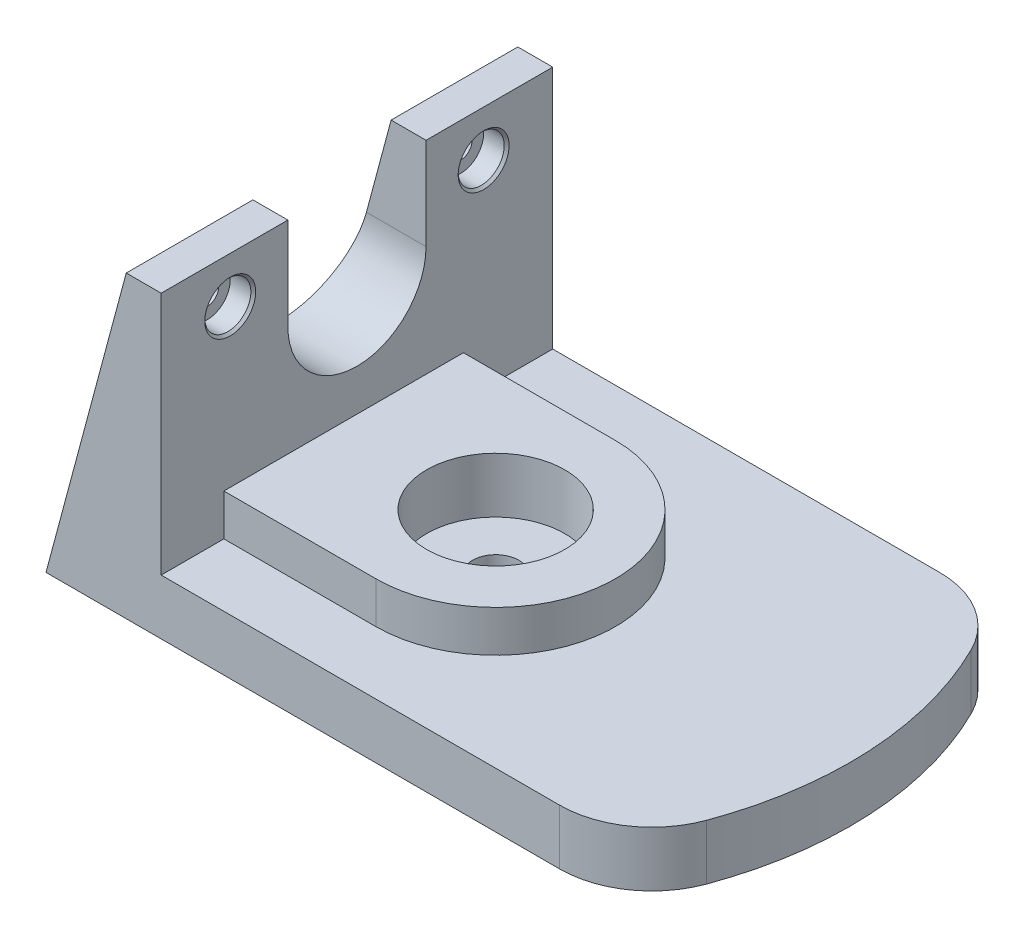
ISO-10303-21;
HEADER;
FILE_DESCRIPTION(('STEP AP214'),'2;1');
FILE_NAME('part.step','',(''),(''),'','','');
FILE_SCHEMA(('AUTOMOTIVE_DESIGN { 1 0 10303 214 1 1 1 1 }'));
ENDSEC;
DATA;
#1=APPLICATION_CONTEXT('core data for automotive mechanical design processes');
#2=APPLICATION_PROTOCOL_DEFINITION('international standard','automotive_design',2000,#1);
#3=PRODUCT_CONTEXT('',#1,'mechanical');
#4=PRODUCT('Part','Part','',(#3));
#5=PRODUCT_RELATED_PRODUCT_CATEGORY('part','',(#4));
#6=PRODUCT_DEFINITION_FORMATION('','',#4);
#7=PRODUCT_DEFINITION_CONTEXT('part definition',#1,'design');
#8=PRODUCT_DEFINITION('design','',#6,#7);
#9=PRODUCT_DEFINITION_SHAPE('','',#8);
#10=(LENGTH_UNIT() NAMED_UNIT(*) SI_UNIT(.MILLI.,.METRE.));
#11=(NAMED_UNIT(*) PLANE_ANGLE_UNIT() SI_UNIT($,.RADIAN.));
#12=(NAMED_UNIT(*) SI_UNIT($,.STERADIAN.) SOLID_ANGLE_UNIT());
#13=UNCERTAINTY_MEASURE_WITH_UNIT(LENGTH_MEASURE(1.E-05),#10,'distance_accuracy_value','');
#14=(GEOMETRIC_REPRESENTATION_CONTEXT(3) GLOBAL_UNCERTAINTY_ASSIGNED_CONTEXT((#13)) GLOBAL_UNIT_ASSIGNED_CONTEXT((#10,
#11,#12)) REPRESENTATION_CONTEXT('',''));
#15=CARTESIAN_POINT('',(0.,0.,0.));
#16=DIRECTION('',(0.,0.,1.));
#17=DIRECTION('',(1.,0.,0.));
#18=AXIS2_PLACEMENT_3D('',#15,#16,#17);
#19=CARTESIAN_POINT('',(58.,21.,2.88479980469305));
#20=DIRECTION('',(0.,-1.,0.));
#21=DIRECTION('',(1.,0.,0.));
#22=AXIS2_PLACEMENT_3D('',#19,#20,#21);
#23=PLANE('',#22);
#24=DIRECTION('',(-1.,0.,0.));
#25=VECTOR('',#24,1.);
#26=CARTESIAN_POINT('',(58.,21.,28.884799804693));
#27=LINE('',#26,#25);
#28=CARTESIAN_POINT('',(58.,21.,28.884799804693));
#29=VERTEX_POINT('',#28);
#30=CARTESIAN_POINT('',(25.,21.,28.8847998046931));
#31=VERTEX_POINT('',#30);
#32=EDGE_CURVE('E199',#29,#31,#27,.T.);
#33=ORIENTED_EDGE('',*,*,#32,.F.);
#34=CARTESIAN_POINT('',(58.,21.,2.88479980469305));
#35=DIRECTION('',(0.,-1.,0.));
#36=DIRECTION('',(1.,0.,0.));
#37=AXIS2_PLACEMENT_3D('',#34,#35,#36);
#38=CIRCLE('',#37,26.);
#39=CARTESIAN_POINT('',(58.,21.,-23.115200195307));
#40=VERTEX_POINT('',#39);
#41=EDGE_CURVE('E215',#40,#29,#38,.T.);
#42=ORIENTED_EDGE('',*,*,#41,.F.);
#43=DIRECTION('',(1.,0.,0.));
#44=VECTOR('',#43,1.);
#45=CARTESIAN_POINT('',(25.,21.,-23.1152001953069));
#46=LINE('',#45,#44);
#47=CARTESIAN_POINT('',(25.,21.,-23.1152001953069));
#48=VERTEX_POINT('',#47);
#49=EDGE_CURVE('E208',#48,#40,#46,.T.);
#50=ORIENTED_EDGE('',*,*,#49,.F.);
#51=DIRECTION('',(0.,0.,-1.));
#52=VECTOR('',#51,1.);
#53=CARTESIAN_POINT('',(25.,21.,28.8847998046931));
#54=LINE('',#53,#52);
#55=EDGE_CURVE('E204',#31,#48,#54,.T.);
#56=ORIENTED_EDGE('',*,*,#55,.F.);
#57=EDGE_LOOP('',(#33,#42,#50,#56));
#58=FACE_BOUND('',#57,.T.);
#59=CARTESIAN_POINT('',(58.,21.,2.88479980469305));
#60=DIRECTION('',(0.,1.,0.));
#61=DIRECTION('',(0.,0.,1.));
#62=AXIS2_PLACEMENT_3D('',#59,#60,#61);
#63=CIRCLE('',#62,15.);
#64=CARTESIAN_POINT('',(58.,21.,17.884799804693));
#65=VERTEX_POINT('',#64);
#66=EDGE_CURVE('E858',#65,#65,#63,.T.);
#67=ORIENTED_EDGE('',*,*,#66,.F.);
#68=EDGE_LOOP('',(#67));
#69=FACE_BOUND('',#68,.T.);
#70=ADVANCED_FACE('F51',(#58,#69),#23,.F.);
#71=CARTESIAN_POINT('',(25.,65.,42.5));
#72=DIRECTION('',(0.,-1.,0.));
#73=DIRECTION('',(0.,0.,-1.));
#74=AXIS2_PLACEMENT_3D('',#71,#72,#73);
#75=PLANE('',#74);
#76=DIRECTION('',(1.,0.,0.));
#77=VECTOR('',#76,1.);
#78=CARTESIAN_POINT('',(0.,65.,15.));
#79=LINE('',#78,#77);
#80=CARTESIAN_POINT('',(17.4166975080225,65.,15.));
#81=VERTEX_POINT('',#80);
#82=CARTESIAN_POINT('',(25.,65.,15.));
#83=VERTEX_POINT('',#82);
#84=EDGE_CURVE('E176',#81,#83,#79,.T.);
#85=ORIENTED_EDGE('',*,*,#84,.F.);
#86=DIRECTION('',(0.,0.,-1.));
#87=VECTOR('',#86,1.);
#88=CARTESIAN_POINT('',(17.4166975080225,65.,42.5));
#89=LINE('',#88,#87);
#90=CARTESIAN_POINT('',(17.4166975080225,65.,42.5));
#91=VERTEX_POINT('',#90);
#92=EDGE_CURVE('E284',#91,#81,#89,.T.);
#93=ORIENTED_EDGE('',*,*,#92,.F.);
#94=DIRECTION('',(-1.,0.,0.));
#95=VECTOR('',#94,1.);
#96=CARTESIAN_POINT('',(25.,65.,42.5));
#97=LINE('',#96,#95);
#98=CARTESIAN_POINT('',(25.,65.,42.5));
#99=VERTEX_POINT('',#98);
#100=EDGE_CURVE('E251',#99,#91,#97,.T.);
#101=ORIENTED_EDGE('',*,*,#100,.F.);
#102=DIRECTION('',(0.,0.,-1.));
#103=VECTOR('',#102,1.);
#104=CARTESIAN_POINT('',(25.,65.,42.5));
#105=LINE('',#104,#103);
#106=EDGE_CURVE('E289',#99,#83,#105,.T.);
#107=ORIENTED_EDGE('',*,*,#106,.T.);
#108=EDGE_LOOP('',(#85,#93,#101,#107));
#109=FACE_BOUND('',#108,.T.);
#110=ADVANCED_FACE('F384',(#109),#75,.F.);
#111=CARTESIAN_POINT('',(25.,12.,42.5));
#112=DIRECTION('',(-1.,0.,0.));
#113=DIRECTION('',(0.,0.,1.));
#114=AXIS2_PLACEMENT_3D('',#111,#112,#113);
#115=PLANE('',#114);
#116=CARTESIAN_POINT('',(25.,55.,-27.5));
#117=DIRECTION('',(1.,0.,0.));
#118=DIRECTION('',(0.,0.,-1.));
#119=AXIS2_PLACEMENT_3D('',#116,#117,#118);
#120=CIRCLE('',#119,5.525);
#121=CARTESIAN_POINT('',(25.,55.,-33.025));
#122=VERTEX_POINT('',#121);
#123=EDGE_CURVE('E424',#122,#122,#120,.T.);
#124=ORIENTED_EDGE('',*,*,#123,.F.);
#125=EDGE_LOOP('',(#124));
#126=FACE_BOUND('',#125,.T.);
#127=CARTESIAN_POINT('',(25.,55.,27.5));
#128=DIRECTION('',(1.,0.,0.));
#129=DIRECTION('',(0.,0.,-1.));
#130=AXIS2_PLACEMENT_3D('',#127,#128,#129);
#131=CIRCLE('',#130,5.525);
#132=CARTESIAN_POINT('',(25.,55.,21.975));
#133=VERTEX_POINT('',#132);
#134=EDGE_CURVE('E311',#133,#133,#131,.T.);
#135=ORIENTED_EDGE('',*,*,#134,.F.);
#136=EDGE_LOOP('',(#135));
#137=FACE_BOUND('',#136,.T.);
#138=DIRECTION('',(0.,-1.,0.));
#139=VECTOR('',#138,1.);
#140=CARTESIAN_POINT('',(25.,12.,15.));
#141=LINE('',#140,#139);
#142=CARTESIAN_POINT('',(25.,45.,15.));
#143=VERTEX_POINT('',#142);
#144=EDGE_CURVE('E195',#83,#143,#141,.T.);
#145=ORIENTED_EDGE('',*,*,#144,.F.);
#146=ORIENTED_EDGE('',*,*,#106,.F.);
#147=DIRECTION('',(0.,1.,0.));
#148=VECTOR('',#147,1.);
#149=CARTESIAN_POINT('',(25.,12.,42.5));
#150=LINE('',#149,#148);
#151=CARTESIAN_POINT('',(25.,12.,42.5));
#152=VERTEX_POINT('',#151);
#153=EDGE_CURVE('E248',#152,#99,#150,.T.);
#154=ORIENTED_EDGE('',*,*,#153,.F.);
#155=DIRECTION('',(0.,0.,-1.));
#156=VECTOR('',#155,1.);
#157=CARTESIAN_POINT('',(25.,12.,42.5));
#158=LINE('',#157,#156);
#159=CARTESIAN_POINT('',(25.,12.,28.8847998046931));
#160=VERTEX_POINT('',#159);
#161=EDGE_CURVE('E292',#152,#160,#158,.T.);
#162=ORIENTED_EDGE('',*,*,#161,.T.);
#163=DIRECTION('',(0.,-1.,0.));
#164=VECTOR('',#163,1.);
#165=CARTESIAN_POINT('',(25.,21.,28.8847998046931));
#166=LINE('',#165,#164);
#167=EDGE_CURVE('E216',#31,#160,#166,.T.);
#168=ORIENTED_EDGE('',*,*,#167,.F.);
#169=ORIENTED_EDGE('',*,*,#55,.T.);
#170=DIRECTION('',(0.,-1.,0.));
#171=VECTOR('',#170,1.);
#172=CARTESIAN_POINT('',(25.,21.,-23.1152001953069));
#173=LINE('',#172,#171);
#174=CARTESIAN_POINT('',(25.,12.,-23.1152001953069));
#175=VERTEX_POINT('',#174);
#176=EDGE_CURVE('E235',#48,#175,#173,.T.);
#177=ORIENTED_EDGE('',*,*,#176,.T.);
#178=CARTESIAN_POINT('',(25.,12.,-42.5));
#179=VERTEX_POINT('',#178);
#180=EDGE_CURVE('E287',#175,#179,#158,.T.);
#181=ORIENTED_EDGE('',*,*,#180,.T.);
#182=DIRECTION('',(0.,1.,0.));
#183=VECTOR('',#182,1.);
#184=CARTESIAN_POINT('',(25.,12.,-42.5));
#185=LINE('',#184,#183);
#186=CARTESIAN_POINT('',(25.,65.,-42.5));
#187=VERTEX_POINT('',#186);
#188=EDGE_CURVE('E264',#179,#187,#185,.T.);
#189=ORIENTED_EDGE('',*,*,#188,.T.);
#190=CARTESIAN_POINT('',(25.,65.,-15.));
#191=VERTEX_POINT('',#190);
#192=EDGE_CURVE('E194',#191,#187,#105,.T.);
#193=ORIENTED_EDGE('',*,*,#192,.F.);
#194=DIRECTION('',(0.,1.,0.));
#195=VECTOR('',#194,1.);
#196=CARTESIAN_POINT('',(25.,12.,-15.));
#197=LINE('',#196,#195);
#198=CARTESIAN_POINT('',(25.,45.,-15.));
#199=VERTEX_POINT('',#198);
#200=EDGE_CURVE('E179',#199,#191,#197,.T.);
#201=ORIENTED_EDGE('',*,*,#200,.F.);
#202=CARTESIAN_POINT('',(25.,45.,0.));
#203=DIRECTION('',(-1.,0.,0.));
#204=DIRECTION('',(0.,0.,1.));
#205=AXIS2_PLACEMENT_3D('',#202,#203,#204);
#206=CIRCLE('',#205,15.);
#207=EDGE_CURVE('E164',#143,#199,#206,.F.);
#208=ORIENTED_EDGE('',*,*,#207,.F.);
#209=EDGE_LOOP('',(#145,#146,#154,#162,#168,#169,#177,#181,#189,#193,#201,#208));
#210=FACE_BOUND('',#209,.T.);
#211=ADVANCED_FACE('F190',(#126,#137,#210),#115,.F.);
#212=CARTESIAN_POINT('',(135.,12.,42.5));
#213=DIRECTION('',(0.,-1.,0.));
#214=DIRECTION('',(1.,0.,0.));
#215=AXIS2_PLACEMENT_3D('',#212,#213,#214);
#216=PLANE('',#215);
#217=CARTESIAN_POINT('',(58.,12.,2.88479980469305));
#218=DIRECTION('',(0.,-1.,0.));
#219=DIRECTION('',(1.,0.,0.));
#220=AXIS2_PLACEMENT_3D('',#217,#218,#219);
#221=CIRCLE('',#220,77.);
#222=CARTESIAN_POINT('',(126.942556382217,12.,-31.4069472998923));
#223=VERTEX_POINT('',#222);
#224=CARTESIAN_POINT('',(130.29709873924,12.,29.3825263843182));
#225=VERTEX_POINT('',#224);
#226=EDGE_CURVE('E244',#223,#225,#221,.T.);
#227=ORIENTED_EDGE('',*,*,#226,.F.);
#228=CARTESIAN_POINT('',(109.035398880342,12.,-22.5));
#229=DIRECTION('',(0.,-1.,0.));
#230=DIRECTION('',(1.,0.,0.));
#231=AXIS2_PLACEMENT_3D('',#228,#229,#230);
#232=CIRCLE('',#231,20.);
#233=CARTESIAN_POINT('',(109.035398880342,12.,-42.5));
#234=VERTEX_POINT('',#233);
#235=EDGE_CURVE('E58',#223,#234,#232,.F.);
#236=ORIENTED_EDGE('',*,*,#235,.T.);
#237=DIRECTION('',(-1.,0.,0.));
#238=VECTOR('',#237,1.);
#239=CARTESIAN_POINT('',(135.,12.,-42.5));
#240=LINE('',#239,#238);
#241=EDGE_CURVE('E241',#234,#179,#240,.T.);
#242=ORIENTED_EDGE('',*,*,#241,.T.);
#243=ORIENTED_EDGE('',*,*,#180,.F.);
#244=DIRECTION('',(1.,0.,0.));
#245=VECTOR('',#244,1.);
#246=CARTESIAN_POINT('',(25.,12.,-23.1152001953069));
#247=LINE('',#246,#245);
#248=CARTESIAN_POINT('',(58.,12.,-23.115200195307));
#249=VERTEX_POINT('',#248);
#250=EDGE_CURVE('E218',#175,#249,#247,.T.);
#251=ORIENTED_EDGE('',*,*,#250,.T.);
#252=CARTESIAN_POINT('',(58.,12.,2.88479980469305));
#253=DIRECTION('',(0.,-1.,0.));
#254=DIRECTION('',(1.,0.,0.));
#255=AXIS2_PLACEMENT_3D('',#252,#253,#254);
#256=CIRCLE('',#255,26.);
#257=CARTESIAN_POINT('',(58.,12.,28.884799804693));
#258=VERTEX_POINT('',#257);
#259=EDGE_CURVE('E202',#249,#258,#256,.T.);
#260=ORIENTED_EDGE('',*,*,#259,.T.);
#261=DIRECTION('',(-1.,0.,0.));
#262=VECTOR('',#261,1.);
#263=CARTESIAN_POINT('',(58.,12.,28.884799804693));
#264=LINE('',#263,#262);
#265=EDGE_CURVE('E198',#258,#160,#264,.T.);
#266=ORIENTED_EDGE('',*,*,#265,.T.);
#267=ORIENTED_EDGE('',*,*,#161,.F.);
#268=DIRECTION('',(-1.,0.,0.));
#269=VECTOR('',#268,1.);
#270=CARTESIAN_POINT('',(135.,12.,42.5));
#271=LINE('',#270,#269);
#272=CARTESIAN_POINT('',(111.518631534243,12.,42.5));
#273=VERTEX_POINT('',#272);
#274=EDGE_CURVE('E249',#273,#152,#271,.T.);
#275=ORIENTED_EDGE('',*,*,#274,.F.);
#276=CARTESIAN_POINT('',(111.518631534243,12.,22.5));
#277=DIRECTION('',(0.,-1.,0.));
#278=DIRECTION('',(1.,0.,0.));
#279=AXIS2_PLACEMENT_3D('',#276,#277,#278);
#280=CIRCLE('',#279,20.);
#281=EDGE_CURVE('E75',#273,#225,#280,.F.);
#282=ORIENTED_EDGE('',*,*,#281,.T.);
#283=EDGE_LOOP('',(#227,#236,#242,#243,#251,#260,#266,#267,#275,#282));
#284=FACE_BOUND('',#283,.T.);
#285=ADVANCED_FACE('F333',(#284),#216,.F.);
#286=CARTESIAN_POINT('',(0.,0.,42.5));
#287=DIRECTION('',(0.,1.,0.));
#288=DIRECTION('',(0.,0.,1.));
#289=AXIS2_PLACEMENT_3D('',#286,#287,#288);
#290=PLANE('',#289);
#291=CARTESIAN_POINT('',(58.,0.,2.88479980469305));
#292=DIRECTION('',(0.,1.,0.));
#293=DIRECTION('',(0.,0.,1.));
#294=AXIS2_PLACEMENT_3D('',#291,#292,#293);
#295=CIRCLE('',#294,4.99999999999999);
#296=CARTESIAN_POINT('',(58.,0.,7.88479980469304));
#297=VERTEX_POINT('',#296);
#298=EDGE_CURVE('E423',#297,#297,#295,.T.);
#299=ORIENTED_EDGE('',*,*,#298,.T.);
#300=EDGE_LOOP('',(#299));
#301=FACE_BOUND('',#300,.T.);
#302=DIRECTION('',(1.,0.,0.));
#303=VECTOR('',#302,1.);
#304=CARTESIAN_POINT('',(0.,0.,-42.5));
#305=LINE('',#304,#303);
#306=CARTESIAN_POINT('',(0.,0.,-42.5));
#307=VERTEX_POINT('',#306);
#308=CARTESIAN_POINT('',(109.035398880342,0.,-42.5));
#309=VERTEX_POINT('',#308);
#310=EDGE_CURVE('E247',#307,#309,#305,.T.);
#311=ORIENTED_EDGE('',*,*,#310,.T.);
#312=CARTESIAN_POINT('',(109.035398880342,0.,-22.5));
#313=DIRECTION('',(0.,1.,0.));
#314=DIRECTION('',(0.,0.,1.));
#315=AXIS2_PLACEMENT_3D('',#312,#313,#314);
#316=CIRCLE('',#315,20.);
#317=CARTESIAN_POINT('',(126.942556382217,0.,-31.4069472998923));
#318=VERTEX_POINT('',#317);
#319=EDGE_CURVE('E321',#309,#318,#316,.F.);
#320=ORIENTED_EDGE('',*,*,#319,.T.);
#321=CARTESIAN_POINT('',(58.,0.,2.88479980469305));
#322=DIRECTION('',(0.,1.,0.));
#323=DIRECTION('',(0.,0.,1.));
#324=AXIS2_PLACEMENT_3D('',#321,#322,#323);
#325=CIRCLE('',#324,77.);
#326=CARTESIAN_POINT('',(130.29709873924,0.,29.3825263843182));
#327=VERTEX_POINT('',#326);
#328=EDGE_CURVE('E227',#327,#318,#325,.T.);
#329=ORIENTED_EDGE('',*,*,#328,.F.);
#330=CARTESIAN_POINT('',(111.518631534243,0.,22.5));
#331=DIRECTION('',(0.,1.,0.));
#332=DIRECTION('',(0.,0.,1.));
#333=AXIS2_PLACEMENT_3D('',#330,#331,#332);
#334=CIRCLE('',#333,20.);
#335=CARTESIAN_POINT('',(111.518631534243,0.,42.5));
#336=VERTEX_POINT('',#335);
#337=EDGE_CURVE('E318',#327,#336,#334,.F.);
#338=ORIENTED_EDGE('',*,*,#337,.T.);
#339=DIRECTION('',(1.,0.,0.));
#340=VECTOR('',#339,1.);
#341=CARTESIAN_POINT('',(0.,0.,42.5));
#342=LINE('',#341,#340);
#343=CARTESIAN_POINT('',(0.,0.,42.5));
#344=VERTEX_POINT('',#343);
#345=EDGE_CURVE('E259',#344,#336,#342,.T.);
#346=ORIENTED_EDGE('',*,*,#345,.F.);
#347=DIRECTION('',(0.,0.,-1.));
#348=VECTOR('',#347,1.);
#349=CARTESIAN_POINT('',(0.,0.,42.5));
#350=LINE('',#349,#348);
#351=EDGE_CURVE('E265',#344,#307,#350,.T.);
#352=ORIENTED_EDGE('',*,*,#351,.T.);
#353=EDGE_LOOP('',(#311,#320,#329,#338,#346,#352));
#354=FACE_BOUND('',#353,.T.);
#355=ADVANCED_FACE('F349',(#301,#354),#290,.F.);
#356=CARTESIAN_POINT('',(0.,0.,42.5));
#357=DIRECTION('',(0.,0.,-1.));
#358=DIRECTION('',(-1.,0.,0.));
#359=AXIS2_PLACEMENT_3D('',#356,#357,#358);
#360=PLANE('',#359);
#361=ORIENTED_EDGE('',*,*,#345,.T.);
#362=DIRECTION('',(0.,1.,0.));
#363=VECTOR('',#362,1.);
#364=CARTESIAN_POINT('',(111.518631534243,12.0000000000001,42.5));
#365=LINE('',#364,#363);
#366=EDGE_CURVE('E11',#336,#273,#365,.T.);
#367=ORIENTED_EDGE('',*,*,#366,.T.);
#368=ORIENTED_EDGE('',*,*,#274,.T.);
#369=ORIENTED_EDGE('',*,*,#153,.T.);
#370=ORIENTED_EDGE('',*,*,#100,.T.);
#371=DIRECTION('',(-0.258819045102514,-0.96592582628907,0.));
#372=VECTOR('',#371,1.);
#373=CARTESIAN_POINT('',(17.4166975080225,65.,42.5));
#374=LINE('',#373,#372);
#375=EDGE_CURVE('E258',#91,#344,#374,.T.);
#376=ORIENTED_EDGE('',*,*,#375,.T.);
#377=EDGE_LOOP('',(#361,#367,#368,#369,#370,#376));
#378=FACE_BOUND('',#377,.T.);
#379=ADVANCED_FACE('F351',(#378),#360,.F.);
#380=CARTESIAN_POINT('',(0.,0.,-42.5));
#381=DIRECTION('',(0.,0.,-1.));
#382=DIRECTION('',(-1.,0.,0.));
#383=AXIS2_PLACEMENT_3D('',#380,#381,#382);
#384=PLANE('',#383);
#385=ORIENTED_EDGE('',*,*,#241,.F.);
#386=DIRECTION('',(0.,-1.,0.));
#387=VECTOR('',#386,1.);
#388=CARTESIAN_POINT('',(109.035398880342,0.,-42.5));
#389=LINE('',#388,#387);
#390=EDGE_CURVE('E305',#234,#309,#389,.T.);
#391=ORIENTED_EDGE('',*,*,#390,.T.);
#392=ORIENTED_EDGE('',*,*,#310,.F.);
#393=DIRECTION('',(-0.258819045102514,-0.96592582628907,0.));
#394=VECTOR('',#393,1.);
#395=CARTESIAN_POINT('',(17.4166975080225,65.,-42.5));
#396=LINE('',#395,#394);
#397=CARTESIAN_POINT('',(17.4166975080225,65.,-42.5));
#398=VERTEX_POINT('',#397);
#399=EDGE_CURVE('E275',#398,#307,#396,.T.);
#400=ORIENTED_EDGE('',*,*,#399,.F.);
#401=DIRECTION('',(-1.,0.,0.));
#402=VECTOR('',#401,1.);
#403=CARTESIAN_POINT('',(25.,65.,-42.5));
#404=LINE('',#403,#402);
#405=EDGE_CURVE('E268',#187,#398,#404,.T.);
#406=ORIENTED_EDGE('',*,*,#405,.F.);
#407=ORIENTED_EDGE('',*,*,#188,.F.);
#408=EDGE_LOOP('',(#385,#391,#392,#400,#406,#407));
#409=FACE_BOUND('',#408,.T.);
#410=ADVANCED_FACE('F345',(#409),#384,.T.);
#411=CARTESIAN_POINT('',(17.4166975080225,65.,-15.));
#412=VERTEX_POINT('',#411);
#413=EDGE_CURVE('E283',#412,#398,#89,.T.);
#414=ORIENTED_EDGE('',*,*,#413,.F.);
#415=DIRECTION('',(1.,0.,0.));
#416=VECTOR('',#415,1.);
#417=CARTESIAN_POINT('',(0.,65.,-15.));
#418=LINE('',#417,#416);
#419=EDGE_CURVE('E188',#412,#191,#418,.T.);
#420=ORIENTED_EDGE('',*,*,#419,.T.);
#421=ORIENTED_EDGE('',*,*,#192,.T.);
#422=ORIENTED_EDGE('',*,*,#405,.T.);
#423=EDGE_LOOP('',(#414,#420,#421,#422));
#424=FACE_BOUND('',#423,.T.);
#425=ADVANCED_FACE('F368',(#424),#75,.F.);
#426=CARTESIAN_POINT('',(17.4166975080225,65.,42.5));
#427=DIRECTION('',(0.96592582628907,-0.258819045102514,0.));
#428=DIRECTION('',(0.258819045102514,0.96592582628907,0.));
#429=AXIS2_PLACEMENT_3D('',#426,#427,#428);
#430=PLANE('',#429);
#431=CARTESIAN_POINT('',(14.7372055837114,55.,-27.5));
#432=DIRECTION('',(0.96592582628907,-0.258819045102514,0.));
#433=DIRECTION('',(0.258819045102514,0.96592582628907,0.));
#434=AXIS2_PLACEMENT_3D('',#431,#432,#433);
#435=ELLIPSE('',#434,2.5881904510252,2.5);
#436=CARTESIAN_POINT('',(15.4070785647891,57.5,-27.5));
#437=VERTEX_POINT('',#436);
#438=EDGE_CURVE('E310',#437,#437,#435,.T.);
#439=ORIENTED_EDGE('',*,*,#438,.T.);
#440=EDGE_LOOP('',(#439));
#441=FACE_BOUND('',#440,.T.);
#442=CARTESIAN_POINT('',(14.7372055837114,55.,27.5));
#443=DIRECTION('',(0.96592582628907,-0.258819045102514,0.));
#444=DIRECTION('',(0.258819045102514,0.96592582628907,0.));
#445=AXIS2_PLACEMENT_3D('',#442,#443,#444);
#446=ELLIPSE('',#445,2.5881904510252,2.5);
#447=CARTESIAN_POINT('',(15.4070785647891,57.5,27.5));
#448=VERTEX_POINT('',#447);
#449=EDGE_CURVE('E303',#448,#448,#446,.T.);
#450=ORIENTED_EDGE('',*,*,#449,.T.);
#451=EDGE_LOOP('',(#450));
#452=FACE_BOUND('',#451,.T.);
#453=DIRECTION('',(0.258819045102514,0.96592582628907,0.));
#454=VECTOR('',#453,1.);
#455=CARTESIAN_POINT('',(17.4166975080225,65.,15.));
#456=LINE('',#455,#454);
#457=CARTESIAN_POINT('',(12.0577136594002,45.,15.));
#458=VERTEX_POINT('',#457);
#459=EDGE_CURVE('E296',#458,#81,#456,.T.);
#460=ORIENTED_EDGE('',*,*,#459,.F.);
#461=CARTESIAN_POINT('',(12.0577136594002,45.,0.));
#462=DIRECTION('',(0.96592582628907,-0.258819045102514,0.));
#463=DIRECTION('',(0.258819045102514,0.96592582628907,0.));
#464=AXIS2_PLACEMENT_3D('',#461,#462,#463);
#465=ELLIPSE('',#464,15.5291427061512,15.);
#466=CARTESIAN_POINT('',(12.0577136594002,45.,-15.));
#467=VERTEX_POINT('',#466);
#468=EDGE_CURVE('E293',#467,#458,#465,.F.);
#469=ORIENTED_EDGE('',*,*,#468,.F.);
#470=DIRECTION('',(-0.258819045102514,-0.96592582628907,0.));
#471=VECTOR('',#470,1.);
#472=CARTESIAN_POINT('',(17.4166975080225,65.,-15.));
#473=LINE('',#472,#471);
#474=EDGE_CURVE('E181',#412,#467,#473,.T.);
#475=ORIENTED_EDGE('',*,*,#474,.F.);
#476=ORIENTED_EDGE('',*,*,#413,.T.);
#477=ORIENTED_EDGE('',*,*,#399,.T.);
#478=ORIENTED_EDGE('',*,*,#351,.F.);
#479=ORIENTED_EDGE('',*,*,#375,.F.);
#480=ORIENTED_EDGE('',*,*,#92,.T.);
#481=EDGE_LOOP('',(#460,#469,#475,#476,#477,#478,#479,#480));
#482=FACE_BOUND('',#481,.T.);
#483=ADVANCED_FACE('F362',(#441,#452,#482),#430,.F.);
#484=CARTESIAN_POINT('',(58.,227.330414711903,2.88479980469305));
#485=DIRECTION('',(0.,-1.,0.));
#486=DIRECTION('',(1.,0.,0.));
#487=AXIS2_PLACEMENT_3D('',#484,#485,#486);
#488=CYLINDRICAL_SURFACE('',#487,77.);
#489=ORIENTED_EDGE('',*,*,#328,.T.);
#490=DIRECTION('',(0.,-1.,0.));
#491=VECTOR('',#490,1.);
#492=CARTESIAN_POINT('',(126.942556382217,227.330414711903,-31.4069472998923));
#493=LINE('',#492,#491);
#494=EDGE_CURVE('E327',#318,#223,#493,.F.);
#495=ORIENTED_EDGE('',*,*,#494,.T.);
#496=ORIENTED_EDGE('',*,*,#226,.T.);
#497=DIRECTION('',(0.,-1.,0.));
#498=VECTOR('',#497,1.);
#499=CARTESIAN_POINT('',(130.29709873924,227.330414711903,29.3825263843182));
#500=LINE('',#499,#498);
#501=EDGE_CURVE('E322',#225,#327,#500,.T.);
#502=ORIENTED_EDGE('',*,*,#501,.T.);
#503=EDGE_LOOP('',(#489,#495,#496,#502));
#504=FACE_BOUND('',#503,.T.);
#505=ADVANCED_FACE('F353',(#504),#488,.T.);
#506=CARTESIAN_POINT('',(58.,21.,28.884799804693));
#507=DIRECTION('',(0.,0.,1.));
#508=DIRECTION('',(1.,0.,0.));
#509=AXIS2_PLACEMENT_3D('',#506,#507,#508);
#510=PLANE('',#509);
#511=ORIENTED_EDGE('',*,*,#265,.F.);
#512=DIRECTION('',(0.,-1.,0.));
#513=VECTOR('',#512,1.);
#514=CARTESIAN_POINT('',(58.,21.,28.884799804693));
#515=LINE('',#514,#513);
#516=EDGE_CURVE('E221',#29,#258,#515,.T.);
#517=ORIENTED_EDGE('',*,*,#516,.F.);
#518=ORIENTED_EDGE('',*,*,#32,.T.);
#519=ORIENTED_EDGE('',*,*,#167,.T.);
#520=EDGE_LOOP('',(#511,#517,#518,#519));
#521=FACE_BOUND('',#520,.T.);
#522=ADVANCED_FACE('F487',(#521),#510,.T.);
#523=CARTESIAN_POINT('',(58.,21.,2.88479980469305));
#524=DIRECTION('',(0.,-1.,0.));
#525=DIRECTION('',(1.,0.,0.));
#526=AXIS2_PLACEMENT_3D('',#523,#524,#525);
#527=CYLINDRICAL_SURFACE('',#526,26.);
#528=ORIENTED_EDGE('',*,*,#259,.F.);
#529=DIRECTION('',(0.,-1.,0.));
#530=VECTOR('',#529,1.);
#531=CARTESIAN_POINT('',(58.,21.,-23.115200195307));
#532=LINE('',#531,#530);
#533=EDGE_CURVE('E230',#40,#249,#532,.T.);
#534=ORIENTED_EDGE('',*,*,#533,.F.);
#535=ORIENTED_EDGE('',*,*,#41,.T.);
#536=ORIENTED_EDGE('',*,*,#516,.T.);
#537=EDGE_LOOP('',(#528,#534,#535,#536));
#538=FACE_BOUND('',#537,.T.);
#539=ADVANCED_FACE('F486',(#538),#527,.T.);
#540=CARTESIAN_POINT('',(25.,21.,-23.1152001953069));
#541=DIRECTION('',(0.,0.,-1.));
#542=DIRECTION('',(-1.,0.,0.));
#543=AXIS2_PLACEMENT_3D('',#540,#541,#542);
#544=PLANE('',#543);
#545=ORIENTED_EDGE('',*,*,#250,.F.);
#546=ORIENTED_EDGE('',*,*,#176,.F.);
#547=ORIENTED_EDGE('',*,*,#49,.T.);
#548=ORIENTED_EDGE('',*,*,#533,.T.);
#549=EDGE_LOOP('',(#545,#546,#547,#548));
#550=FACE_BOUND('',#549,.T.);
#551=ADVANCED_FACE('F482',(#550),#544,.T.);
#552=CARTESIAN_POINT('',(0.,45.,15.));
#553=DIRECTION('',(0.,0.,-1.));
#554=DIRECTION('',(-1.,0.,0.));
#555=AXIS2_PLACEMENT_3D('',#552,#553,#554);
#556=PLANE('',#555);
#557=ORIENTED_EDGE('',*,*,#144,.T.);
#558=DIRECTION('',(1.,0.,0.));
#559=VECTOR('',#558,1.);
#560=CARTESIAN_POINT('',(0.,45.,15.));
#561=LINE('',#560,#559);
#562=EDGE_CURVE('E173',#458,#143,#561,.T.);
#563=ORIENTED_EDGE('',*,*,#562,.F.);
#564=ORIENTED_EDGE('',*,*,#459,.T.);
#565=ORIENTED_EDGE('',*,*,#84,.T.);
#566=EDGE_LOOP('',(#557,#563,#564,#565));
#567=FACE_BOUND('',#566,.T.);
#568=ADVANCED_FACE('F373',(#567),#556,.T.);
#569=CARTESIAN_POINT('',(0.,65.,-15.));
#570=DIRECTION('',(0.,0.,1.));
#571=DIRECTION('',(0.,-1.,0.));
#572=AXIS2_PLACEMENT_3D('',#569,#570,#571);
#573=PLANE('',#572);
#574=ORIENTED_EDGE('',*,*,#200,.T.);
#575=ORIENTED_EDGE('',*,*,#419,.F.);
#576=ORIENTED_EDGE('',*,*,#474,.T.);
#577=DIRECTION('',(1.,0.,0.));
#578=VECTOR('',#577,1.);
#579=CARTESIAN_POINT('',(0.,45.,-15.));
#580=LINE('',#579,#578);
#581=EDGE_CURVE('E169',#467,#199,#580,.T.);
#582=ORIENTED_EDGE('',*,*,#581,.T.);
#583=EDGE_LOOP('',(#574,#575,#576,#582));
#584=FACE_BOUND('',#583,.T.);
#585=ADVANCED_FACE('F177',(#584),#573,.T.);
#586=CARTESIAN_POINT('',(0.,45.,0.));
#587=DIRECTION('',(1.,0.,0.));
#588=DIRECTION('',(0.,0.,-1.));
#589=AXIS2_PLACEMENT_3D('',#586,#587,#588);
#590=CYLINDRICAL_SURFACE('',#589,15.);
#591=ORIENTED_EDGE('',*,*,#207,.T.);
#592=ORIENTED_EDGE('',*,*,#581,.F.);
#593=ORIENTED_EDGE('',*,*,#468,.T.);
#594=ORIENTED_EDGE('',*,*,#562,.T.);
#595=EDGE_LOOP('',(#591,#592,#593,#594));
#596=FACE_BOUND('',#595,.T.);
#597=ADVANCED_FACE('F170',(#596),#590,.F.);
#598=CARTESIAN_POINT('',(25.,55.,27.5));
#599=DIRECTION('',(1.,0.,0.));
#600=DIRECTION('',(0.,0.,-1.));
#601=AXIS2_PLACEMENT_3D('',#598,#599,#600);
#602=CYLINDRICAL_SURFACE('',#601,2.5);
#603=CARTESIAN_POINT('',(20.,55.,27.5));
#604=DIRECTION('',(1.,0.,0.));
#605=DIRECTION('',(0.,0.,-1.));
#606=AXIS2_PLACEMENT_3D('',#603,#604,#605);
#607=CIRCLE('',#606,2.5);
#608=CARTESIAN_POINT('',(20.,55.,25.));
#609=VERTEX_POINT('',#608);
#610=EDGE_CURVE('E306',#609,#609,#607,.T.);
#611=ORIENTED_EDGE('',*,*,#610,.T.);
#612=EDGE_LOOP('',(#611));
#613=FACE_BOUND('',#612,.T.);
#614=ORIENTED_EDGE('',*,*,#449,.F.);
#615=EDGE_LOOP('',(#614));
#616=FACE_BOUND('',#615,.T.);
#617=ADVANCED_FACE('F464',(#613,#616),#602,.F.);
#618=CARTESIAN_POINT('',(20.,60.,27.5));
#619=DIRECTION('',(-1.,0.,0.));
#620=DIRECTION('',(0.,0.,1.));
#621=AXIS2_PLACEMENT_3D('',#618,#619,#620);
#622=PLANE('',#621);
#623=ORIENTED_EDGE('',*,*,#610,.F.);
#624=EDGE_LOOP('',(#623));
#625=FACE_BOUND('',#624,.T.);
#626=CARTESIAN_POINT('',(20.,55.,27.5));
#627=DIRECTION('',(1.,0.,0.));
#628=DIRECTION('',(0.,0.,-1.));
#629=AXIS2_PLACEMENT_3D('',#626,#627,#628);
#630=CIRCLE('',#629,5.);
#631=CARTESIAN_POINT('',(20.,55.,22.5));
#632=VERTEX_POINT('',#631);
#633=EDGE_CURVE('E455',#632,#632,#630,.T.);
#634=ORIENTED_EDGE('',*,*,#633,.T.);
#635=EDGE_LOOP('',(#634));
#636=FACE_BOUND('',#635,.T.);
#637=ADVANCED_FACE('F461',(#625,#636),#622,.F.);
#638=CARTESIAN_POINT('',(25.,55.,27.5));
#639=DIRECTION('',(1.,0.,0.));
#640=DIRECTION('',(0.,0.,-1.));
#641=AXIS2_PLACEMENT_3D('',#638,#639,#640);
#642=CYLINDRICAL_SURFACE('',#641,5.);
#643=ORIENTED_EDGE('',*,*,#633,.F.);
#644=EDGE_LOOP('',(#643));
#645=FACE_BOUND('',#644,.T.);
#646=CARTESIAN_POINT('',(24.475,55.,27.5));
#647=DIRECTION('',(1.,0.,0.));
#648=DIRECTION('',(0.,0.,-1.));
#649=AXIS2_PLACEMENT_3D('',#646,#647,#648);
#650=CIRCLE('',#649,5.);
#651=CARTESIAN_POINT('',(24.475,55.,22.5));
#652=VERTEX_POINT('',#651);
#653=EDGE_CURVE('E446',#652,#652,#650,.T.);
#654=ORIENTED_EDGE('',*,*,#653,.T.);
#655=EDGE_LOOP('',(#654));
#656=FACE_BOUND('',#655,.T.);
#657=ADVANCED_FACE('F466',(#645,#656),#642,.F.);
#658=CARTESIAN_POINT('',(25.,55.,27.5));
#659=DIRECTION('',(1.,0.,0.));
#660=DIRECTION('',(0.,0.,-1.));
#661=AXIS2_PLACEMENT_3D('',#658,#659,#660);
#662=CONICAL_SURFACE('',#661,5.525,0.785398163397452);
#663=ORIENTED_EDGE('',*,*,#653,.F.);
#664=EDGE_LOOP('',(#663));
#665=FACE_BOUND('',#664,.T.);
#666=ORIENTED_EDGE('',*,*,#134,.T.);
#667=EDGE_LOOP('',(#666));
#668=FACE_BOUND('',#667,.T.);
#669=ADVANCED_FACE('F471',(#665,#668),#662,.F.);
#670=CARTESIAN_POINT('',(25.,55.,-27.5));
#671=DIRECTION('',(1.,0.,0.));
#672=DIRECTION('',(0.,0.,-1.));
#673=AXIS2_PLACEMENT_3D('',#670,#671,#672);
#674=CYLINDRICAL_SURFACE('',#673,2.5);
#675=CARTESIAN_POINT('',(20.,55.,-27.5));
#676=DIRECTION('',(1.,0.,0.));
#677=DIRECTION('',(0.,0.,-1.));
#678=AXIS2_PLACEMENT_3D('',#675,#676,#677);
#679=CIRCLE('',#678,2.5);
#680=CARTESIAN_POINT('',(20.,55.,-30.));
#681=VERTEX_POINT('',#680);
#682=EDGE_CURVE('E314',#681,#681,#679,.T.);
#683=ORIENTED_EDGE('',*,*,#682,.T.);
#684=EDGE_LOOP('',(#683));
#685=FACE_BOUND('',#684,.T.);
#686=ORIENTED_EDGE('',*,*,#438,.F.);
#687=EDGE_LOOP('',(#686));
#688=FACE_BOUND('',#687,.T.);
#689=ADVANCED_FACE('F546',(#685,#688),#674,.F.);
#690=CARTESIAN_POINT('',(20.,60.,-27.5));
#691=DIRECTION('',(-1.,0.,0.));
#692=DIRECTION('',(0.,0.,1.));
#693=AXIS2_PLACEMENT_3D('',#690,#691,#692);
#694=PLANE('',#693);
#695=ORIENTED_EDGE('',*,*,#682,.F.);
#696=EDGE_LOOP('',(#695));
#697=FACE_BOUND('',#696,.T.);
#698=CARTESIAN_POINT('',(20.,55.,-27.5));
#699=DIRECTION('',(1.,0.,0.));
#700=DIRECTION('',(0.,0.,-1.));
#701=AXIS2_PLACEMENT_3D('',#698,#699,#700);
#702=CIRCLE('',#701,5.);
#703=CARTESIAN_POINT('',(20.,55.,-32.5));
#704=VERTEX_POINT('',#703);
#705=EDGE_CURVE('E439',#704,#704,#702,.T.);
#706=ORIENTED_EDGE('',*,*,#705,.T.);
#707=EDGE_LOOP('',(#706));
#708=FACE_BOUND('',#707,.T.);
#709=ADVANCED_FACE('F558',(#697,#708),#694,.F.);
#710=CARTESIAN_POINT('',(25.,55.,-27.5));
#711=DIRECTION('',(1.,0.,0.));
#712=DIRECTION('',(0.,0.,-1.));
#713=AXIS2_PLACEMENT_3D('',#710,#711,#712);
#714=CYLINDRICAL_SURFACE('',#713,5.);
#715=ORIENTED_EDGE('',*,*,#705,.F.);
#716=EDGE_LOOP('',(#715));
#717=FACE_BOUND('',#716,.T.);
#718=CARTESIAN_POINT('',(24.475,55.,-27.5));
#719=DIRECTION('',(1.,0.,0.));
#720=DIRECTION('',(0.,0.,-1.));
#721=AXIS2_PLACEMENT_3D('',#718,#719,#720);
#722=CIRCLE('',#721,5.);
#723=CARTESIAN_POINT('',(24.475,55.,-32.5));
#724=VERTEX_POINT('',#723);
#725=EDGE_CURVE('E429',#724,#724,#722,.T.);
#726=ORIENTED_EDGE('',*,*,#725,.T.);
#727=EDGE_LOOP('',(#726));
#728=FACE_BOUND('',#727,.T.);
#729=ADVANCED_FACE('F567',(#717,#728),#714,.F.);
#730=CARTESIAN_POINT('',(25.,55.,-27.5));
#731=DIRECTION('',(1.,0.,0.));
#732=DIRECTION('',(0.,0.,-1.));
#733=AXIS2_PLACEMENT_3D('',#730,#731,#732);
#734=CONICAL_SURFACE('',#733,5.525,0.785398163397452);
#735=ORIENTED_EDGE('',*,*,#725,.F.);
#736=EDGE_LOOP('',(#735));
#737=FACE_BOUND('',#736,.T.);
#738=ORIENTED_EDGE('',*,*,#123,.T.);
#739=EDGE_LOOP('',(#738));
#740=FACE_BOUND('',#739,.T.);
#741=ADVANCED_FACE('F579',(#737,#740),#734,.F.);
#742=CARTESIAN_POINT('',(58.,21.,2.88479980469305));
#743=DIRECTION('',(0.,1.,0.));
#744=DIRECTION('',(0.,0.,1.));
#745=AXIS2_PLACEMENT_3D('',#742,#743,#744);
#746=CYLINDRICAL_SURFACE('',#745,4.99999999999999);
#747=ORIENTED_EDGE('',*,*,#298,.F.);
#748=EDGE_LOOP('',(#747));
#749=FACE_BOUND('',#748,.T.);
#750=CARTESIAN_POINT('',(58.,8.99999999999999,2.88479980469305));
#751=DIRECTION('',(0.,1.,0.));
#752=DIRECTION('',(0.,0.,1.));
#753=AXIS2_PLACEMENT_3D('',#750,#751,#752);
#754=CIRCLE('',#753,4.99999999999999);
#755=CARTESIAN_POINT('',(58.,8.99999999999999,7.88479980469304));
#756=VERTEX_POINT('',#755);
#757=EDGE_CURVE('E422',#756,#756,#754,.T.);
#758=ORIENTED_EDGE('',*,*,#757,.T.);
#759=EDGE_LOOP('',(#758));
#760=FACE_BOUND('',#759,.T.);
#761=ADVANCED_FACE('F588',(#749,#760),#746,.F.);
#762=CARTESIAN_POINT('',(63.,8.99999999999999,2.88479980469305));
#763=DIRECTION('',(0.,-1.,0.));
#764=DIRECTION('',(0.,0.,-1.));
#765=AXIS2_PLACEMENT_3D('',#762,#763,#764);
#766=PLANE('',#765);
#767=ORIENTED_EDGE('',*,*,#757,.F.);
#768=EDGE_LOOP('',(#767));
#769=FACE_BOUND('',#768,.T.);
#770=CARTESIAN_POINT('',(58.,8.99999999999999,2.88479980469305));
#771=DIRECTION('',(0.,1.,0.));
#772=DIRECTION('',(0.,0.,1.));
#773=AXIS2_PLACEMENT_3D('',#770,#771,#772);
#774=CIRCLE('',#773,15.);
#775=CARTESIAN_POINT('',(58.,8.99999999999999,17.884799804693));
#776=VERTEX_POINT('',#775);
#777=EDGE_CURVE('E433',#776,#776,#774,.T.);
#778=ORIENTED_EDGE('',*,*,#777,.T.);
#779=EDGE_LOOP('',(#778));
#780=FACE_BOUND('',#779,.T.);
#781=ADVANCED_FACE('F594',(#769,#780),#766,.F.);
#782=CARTESIAN_POINT('',(58.,21.,2.88479980469305));
#783=DIRECTION('',(0.,1.,0.));
#784=DIRECTION('',(0.,0.,1.));
#785=AXIS2_PLACEMENT_3D('',#782,#783,#784);
#786=CYLINDRICAL_SURFACE('',#785,15.);
#787=ORIENTED_EDGE('',*,*,#777,.F.);
#788=EDGE_LOOP('',(#787));
#789=FACE_BOUND('',#788,.T.);
#790=ORIENTED_EDGE('',*,*,#66,.T.);
#791=EDGE_LOOP('',(#790));
#792=FACE_BOUND('',#791,.T.);
#793=ADVANCED_FACE('F603',(#789,#792),#786,.F.);
#794=CARTESIAN_POINT('',(109.035398880342,227.330414711903,-22.5));
#795=DIRECTION('',(0.,-1.,0.));
#796=DIRECTION('',(1.,0.,0.));
#797=AXIS2_PLACEMENT_3D('',#794,#795,#796);
#798=CYLINDRICAL_SURFACE('',#797,20.);
#799=ORIENTED_EDGE('',*,*,#235,.F.);
#800=ORIENTED_EDGE('',*,*,#494,.F.);
#801=ORIENTED_EDGE('',*,*,#319,.F.);
#802=ORIENTED_EDGE('',*,*,#390,.F.);
#803=EDGE_LOOP('',(#799,#800,#801,#802));
#804=FACE_BOUND('',#803,.T.);
#805=ADVANCED_FACE('F347',(#804),#798,.T.);
#806=CARTESIAN_POINT('',(111.518631534243,227.330414711903,22.5));
#807=DIRECTION('',(0.,-1.,0.));
#808=DIRECTION('',(1.,0.,0.));
#809=AXIS2_PLACEMENT_3D('',#806,#807,#808);
#810=CYLINDRICAL_SURFACE('',#809,20.);
#811=ORIENTED_EDGE('',*,*,#281,.F.);
#812=ORIENTED_EDGE('',*,*,#366,.F.);
#813=ORIENTED_EDGE('',*,*,#337,.F.);
#814=ORIENTED_EDGE('',*,*,#501,.F.);
#815=EDGE_LOOP('',(#811,#812,#813,#814));
#816=FACE_BOUND('',#815,.T.);
#817=ADVANCED_FACE('F52',(#816),#810,.T.);
#818=CLOSED_SHELL('',(#70,#110,#211,#285,#355,#379,#410,#425,#483,#505,#522,#539,#551,#568,#585,
#597,#617,#637,#657,#669,#689,#709,#729,#741,#761,#781,#793,#805,#817));
#819=MANIFOLD_SOLID_BREP('B2',#818);
#820=ADVANCED_BREP_SHAPE_REPRESENTATION('',(#18,#819),#14);
#821=SHAPE_DEFINITION_REPRESENTATION(#9,#820);
ENDSEC;
END-ISO-10303-21;
